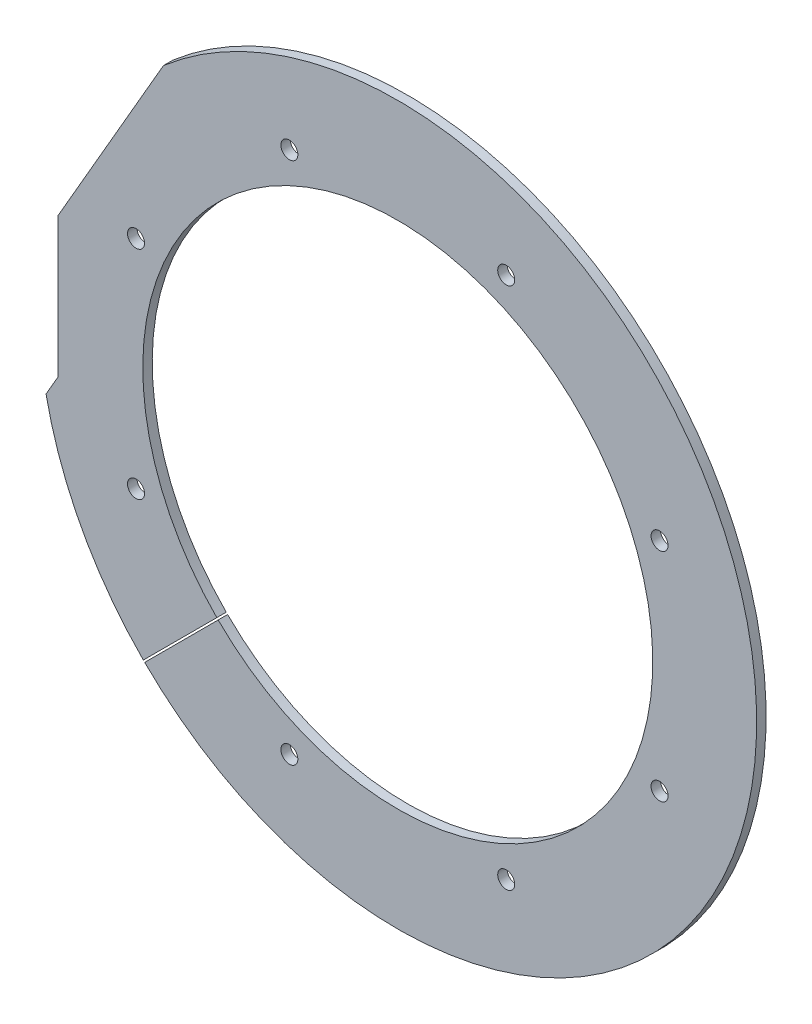
ISO-10303-21;
HEADER;
FILE_DESCRIPTION(('STEP AP214'),'2;1');
FILE_NAME('part.step','',(''),(''),'','','');
FILE_SCHEMA(('AUTOMOTIVE_DESIGN { 1 0 10303 214 1 1 1 1 }'));
ENDSEC;
DATA;
#1=APPLICATION_CONTEXT('core data for automotive mechanical design processes');
#2=APPLICATION_PROTOCOL_DEFINITION('international standard','automotive_design',2000,#1);
#3=PRODUCT_CONTEXT('',#1,'mechanical');
#4=PRODUCT('Part','Part','',(#3));
#5=PRODUCT_RELATED_PRODUCT_CATEGORY('part','',(#4));
#6=PRODUCT_DEFINITION_FORMATION('','',#4);
#7=PRODUCT_DEFINITION_CONTEXT('part definition',#1,'design');
#8=PRODUCT_DEFINITION('design','',#6,#7);
#9=PRODUCT_DEFINITION_SHAPE('','',#8);
#10=(LENGTH_UNIT() NAMED_UNIT(*) SI_UNIT(.MILLI.,.METRE.));
#11=(NAMED_UNIT(*) PLANE_ANGLE_UNIT() SI_UNIT($,.RADIAN.));
#12=(NAMED_UNIT(*) SI_UNIT($,.STERADIAN.) SOLID_ANGLE_UNIT());
#13=UNCERTAINTY_MEASURE_WITH_UNIT(LENGTH_MEASURE(1.E-05),#10,'distance_accuracy_value','');
#14=(GEOMETRIC_REPRESENTATION_CONTEXT(3) GLOBAL_UNCERTAINTY_ASSIGNED_CONTEXT((#13)) GLOBAL_UNIT_ASSIGNED_CONTEXT((#10,
#11,#12)) REPRESENTATION_CONTEXT('',''));
#15=CARTESIAN_POINT('',(0.,0.,0.));
#16=DIRECTION('',(0.,0.,1.));
#17=DIRECTION('',(1.,0.,0.));
#18=AXIS2_PLACEMENT_3D('',#15,#16,#17);
#19=CARTESIAN_POINT('',(6.21070166639274,-0.88442588994114,-166.));
#20=DIRECTION('',(0.,0.,1.));
#21=DIRECTION('',(0.,-1.,0.));
#22=AXIS2_PLACEMENT_3D('',#19,#20,#21);
#23=PLANE('',#22);
#24=CARTESIAN_POINT('',(-57.40251485476,138.5819298767,-166.));
#25=DIRECTION('',(0.,0.,1.));
#26=DIRECTION('',(1.,1.97189285135712E-13,0.));
#27=AXIS2_PLACEMENT_3D('',#24,#25,#26);
#28=CIRCLE('',#27,4.5);
#29=CARTESIAN_POINT('',(-52.90251485476,138.581929876701,-166.));
#30=VERTEX_POINT('',#29);
#31=EDGE_CURVE('E123',#30,#30,#28,.T.);
#32=ORIENTED_EDGE('',*,*,#31,.F.);
#33=EDGE_LOOP('',(#32));
#34=FACE_BOUND('',#33,.T.);
#35=CARTESIAN_POINT('',(-57.40251485476,-138.5819298767,-166.));
#36=DIRECTION('',(0.,0.,1.));
#37=DIRECTION('',(1.,1.97189285135711E-13,0.));
#38=AXIS2_PLACEMENT_3D('',#35,#36,#37);
#39=CIRCLE('',#38,4.5);
#40=CARTESIAN_POINT('',(-52.90251485476,-138.581929876699,-166.));
#41=VERTEX_POINT('',#40);
#42=EDGE_CURVE('E127',#41,#41,#39,.T.);
#43=ORIENTED_EDGE('',*,*,#42,.F.);
#44=EDGE_LOOP('',(#43));
#45=FACE_BOUND('',#44,.T.);
#46=CARTESIAN_POINT('',(57.40251485476,138.5819298767,-166.));
#47=DIRECTION('',(0.,0.,1.));
#48=DIRECTION('',(1.,2.15693002212797E-13,0.));
#49=AXIS2_PLACEMENT_3D('',#46,#47,#48);
#50=CIRCLE('',#49,4.5);
#51=CARTESIAN_POINT('',(61.90251485476,138.581929876701,-166.));
#52=VERTEX_POINT('',#51);
#53=EDGE_CURVE('E131',#52,#52,#50,.T.);
#54=ORIENTED_EDGE('',*,*,#53,.F.);
#55=EDGE_LOOP('',(#54));
#56=FACE_BOUND('',#55,.T.);
#57=CARTESIAN_POINT('',(57.40251485476,-138.5819298767,-166.));
#58=DIRECTION('',(0.,0.,1.));
#59=DIRECTION('',(1.,2.15693002212797E-13,0.));
#60=AXIS2_PLACEMENT_3D('',#57,#58,#59);
#61=CIRCLE('',#60,4.5);
#62=CARTESIAN_POINT('',(61.90251485476,-138.581929876699,-166.));
#63=VERTEX_POINT('',#62);
#64=EDGE_CURVE('E135',#63,#63,#61,.T.);
#65=ORIENTED_EDGE('',*,*,#64,.F.);
#66=EDGE_LOOP('',(#65));
#67=FACE_BOUND('',#66,.T.);
#68=CARTESIAN_POINT('',(-138.5819298767,-57.40251485476,-166.));
#69=DIRECTION('',(0.,0.,1.));
#70=DIRECTION('',(1.,2.06441143674253E-13,0.));
#71=AXIS2_PLACEMENT_3D('',#68,#69,#70);
#72=CIRCLE('',#71,4.5);
#73=CARTESIAN_POINT('',(-134.0819298767,-57.4025148547591,-166.));
#74=VERTEX_POINT('',#73);
#75=EDGE_CURVE('E139',#74,#74,#72,.T.);
#76=ORIENTED_EDGE('',*,*,#75,.F.);
#77=EDGE_LOOP('',(#76));
#78=FACE_BOUND('',#77,.T.);
#79=CARTESIAN_POINT('',(-138.5819298767,57.40251485476,-166.));
#80=DIRECTION('',(0.,0.,1.));
#81=DIRECTION('',(1.,2.06441143674256E-13,0.));
#82=AXIS2_PLACEMENT_3D('',#79,#80,#81);
#83=CIRCLE('',#82,4.5);
#84=CARTESIAN_POINT('',(-134.0819298767,57.4025148547609,-166.));
#85=VERTEX_POINT('',#84);
#86=EDGE_CURVE('E143',#85,#85,#83,.T.);
#87=ORIENTED_EDGE('',*,*,#86,.F.);
#88=EDGE_LOOP('',(#87));
#89=FACE_BOUND('',#88,.T.);
#90=CARTESIAN_POINT('',(138.5819298767,57.40251485476,-166.));
#91=DIRECTION('',(0.,0.,1.));
#92=DIRECTION('',(1.,2.07983120097346E-13,0.));
#93=AXIS2_PLACEMENT_3D('',#90,#91,#92);
#94=CIRCLE('',#93,4.5);
#95=CARTESIAN_POINT('',(143.0819298767,57.4025148547609,-166.));
#96=VERTEX_POINT('',#95);
#97=EDGE_CURVE('E147',#96,#96,#94,.T.);
#98=ORIENTED_EDGE('',*,*,#97,.F.);
#99=EDGE_LOOP('',(#98));
#100=FACE_BOUND('',#99,.T.);
#101=CARTESIAN_POINT('',(138.5819298767,-57.40251485476,-166.));
#102=DIRECTION('',(0.,0.,1.));
#103=DIRECTION('',(1.,2.07983120097343E-13,0.));
#104=AXIS2_PLACEMENT_3D('',#101,#102,#103);
#105=CIRCLE('',#104,4.5);
#106=CARTESIAN_POINT('',(143.0819298767,-57.4025148547591,-166.));
#107=VERTEX_POINT('',#106);
#108=EDGE_CURVE('E151',#107,#107,#105,.T.);
#109=ORIENTED_EDGE('',*,*,#108,.F.);
#110=EDGE_LOOP('',(#109));
#111=FACE_BOUND('',#110,.T.);
#112=DIRECTION('',(0.,-1.,0.));
#113=VECTOR('',#112,1.);
#114=CARTESIAN_POINT('',(-180.,1.89516210700703,-166.));
#115=LINE('',#114,#113);
#116=CARTESIAN_POINT('',(-180.,47.,-166.));
#117=VERTEX_POINT('',#116);
#118=CARTESIAN_POINT('',(-180.,-27.,-166.));
#119=VERTEX_POINT('',#118);
#120=EDGE_CURVE('E159',#117,#119,#115,.T.);
#121=ORIENTED_EDGE('',*,*,#120,.T.);
#122=DIRECTION('',(0.500000000002494,0.866025403782999,0.));
#123=VECTOR('',#122,1.);
#124=CARTESIAN_POINT('',(-122.138949276037,73.2182796325579,-166.));
#125=LINE('',#124,#123);
#126=CARTESIAN_POINT('',(-186.210631307282,-37.7571289712417,-166.));
#127=VERTEX_POINT('',#126);
#128=EDGE_CURVE('E192',#119,#127,#125,.F.);
#129=ORIENTED_EDGE('',*,*,#128,.T.);
#130=CARTESIAN_POINT('',(0.,0.,-166.));
#131=DIRECTION('',(0.,0.,1.));
#132=DIRECTION('',(-0.980055954248756,-0.198721731427544,0.));
#133=AXIS2_PLACEMENT_3D('',#130,#131,#132);
#134=CIRCLE('',#133,190.);
#135=CARTESIAN_POINT('',(-134.703376613408,-133.9962698322,-166.));
#136=VERTEX_POINT('',#135);
#137=EDGE_CURVE('E184',#127,#136,#134,.T.);
#138=ORIENTED_EDGE('',*,*,#137,.T.);
#139=DIRECTION('',(-0.707106781186639,-0.707106781186456,0.));
#140=VECTOR('',#139,1.);
#141=CARTESIAN_POINT('',(2.30958449764395,3.01669127880866,-166.));
#142=LINE('',#141,#140);
#143=CARTESIAN_POINT('',(-95.812314120037,-95.1052073388425,-166.));
#144=VERTEX_POINT('',#143);
#145=EDGE_CURVE('E179',#136,#144,#142,.F.);
#146=ORIENTED_EDGE('',*,*,#145,.T.);
#147=CARTESIAN_POINT('',(0.,0.,-166.));
#148=DIRECTION('',(0.,0.,1.));
#149=DIRECTION('',(-0.704483017324885,-0.709720845333449,0.));
#150=AXIS2_PLACEMENT_3D('',#147,#148,#149);
#151=CIRCLE('',#150,135.);
#152=CARTESIAN_POINT('',(-95.1052073388498,-95.8123141200228,-166.));
#153=VERTEX_POINT('',#152);
#154=EDGE_CURVE('E175',#153,#144,#151,.T.);
#155=ORIENTED_EDGE('',*,*,#154,.F.);
#156=DIRECTION('',(0.707106781186457,0.707106781186639,0.));
#157=VECTOR('',#156,1.);
#158=CARTESIAN_POINT('',(3.01669127880774,2.30958449764304,-166.));
#159=LINE('',#158,#157);
#160=CARTESIAN_POINT('',(-133.996269832188,-134.703376613425,-166.));
#161=VERTEX_POINT('',#160);
#162=EDGE_CURVE('E88',#153,#161,#159,.F.);
#163=ORIENTED_EDGE('',*,*,#162,.T.);
#164=CARTESIAN_POINT('',(0.,0.,-166.));
#165=DIRECTION('',(0.,0.,1.));
#166=DIRECTION('',(-0.705243525432436,-0.708965140070814,0.));
#167=AXIS2_PLACEMENT_3D('',#164,#165,#166);
#168=CIRCLE('',#167,190.);
#169=CARTESIAN_POINT('',(-124.041953570399,143.922179508384,-166.));
#170=VERTEX_POINT('',#169);
#171=EDGE_CURVE('E83',#161,#170,#168,.T.);
#172=ORIENTED_EDGE('',*,*,#171,.T.);
#173=DIRECTION('',(0.499999999999866,0.866025403784516,0.));
#174=VECTOR('',#173,1.);
#175=CARTESIAN_POINT('',(-154.181889216584,91.718279632334,-166.));
#176=LINE('',#175,#174);
#177=EDGE_CURVE('E22',#170,#117,#176,.F.);
#178=ORIENTED_EDGE('',*,*,#177,.T.);
#179=EDGE_LOOP('',(#121,#129,#138,#146,#155,#163,#172,#178));
#180=FACE_BOUND('',#179,.T.);
#181=ADVANCED_FACE('F18',(#34,#45,#56,#67,#78,#89,#100,#111,#180),#23,.T.);
#182=CARTESIAN_POINT('',(-183.10531565365,-32.3785644856249,-168.5));
#183=DIRECTION('',(0.866025403782999,-0.500000000002494,0.));
#184=DIRECTION('',(0.500000000002494,0.866025403782999,0.));
#185=AXIS2_PLACEMENT_3D('',#182,#183,#184);
#186=PLANE('',#185);
#187=ORIENTED_EDGE('',*,*,#128,.F.);
#188=DIRECTION('',(0.,0.,-1.));
#189=VECTOR('',#188,1.);
#190=CARTESIAN_POINT('',(-180.,-27.,-168.5));
#191=LINE('',#190,#189);
#192=CARTESIAN_POINT('',(-180.,-27.,-171.));
#193=VERTEX_POINT('',#192);
#194=EDGE_CURVE('E155',#119,#193,#191,.T.);
#195=ORIENTED_EDGE('',*,*,#194,.T.);
#196=DIRECTION('',(-0.500000000002494,-0.866025403782999,0.));
#197=VECTOR('',#196,1.);
#198=CARTESIAN_POINT('',(-183.10531565365,-32.378564485625,-171.));
#199=LINE('',#198,#197);
#200=CARTESIAN_POINT('',(-186.210631307267,-37.7571289712162,-171.));
#201=VERTEX_POINT('',#200);
#202=EDGE_CURVE('E119',#193,#201,#199,.T.);
#203=ORIENTED_EDGE('',*,*,#202,.T.);
#204=DIRECTION('',(0.,0.,1.));
#205=VECTOR('',#204,1.);
#206=CARTESIAN_POINT('',(-186.210631307263,-37.7571289712334,-171.));
#207=LINE('',#206,#205);
#208=EDGE_CURVE('E188',#201,#127,#207,.T.);
#209=ORIENTED_EDGE('',*,*,#208,.T.);
#210=EDGE_LOOP('',(#187,#195,#203,#209));
#211=FACE_BOUND('',#210,.T.);
#212=ADVANCED_FACE('F340',(#211),#186,.F.);
#213=CARTESIAN_POINT('',(-7.34812490395629E-10,-3.67432266049955E-10,-6000171.));
#214=DIRECTION('',(0.,0.,1.));
#215=DIRECTION('',(0.,-1.,0.));
#216=AXIS2_PLACEMENT_3D('',#213,#214,#215);
#217=CYLINDRICAL_SURFACE('',#216,190.);
#218=DIRECTION('',(0.,0.,1.));
#219=VECTOR('',#218,1.);
#220=CARTESIAN_POINT('',(-134.703376613417,-133.996269832201,-171.));
#221=LINE('',#220,#219);
#222=CARTESIAN_POINT('',(-134.703376613413,-133.996269832205,-171.));
#223=VERTEX_POINT('',#222);
#224=EDGE_CURVE('E180',#223,#136,#221,.T.);
#225=ORIENTED_EDGE('',*,*,#224,.T.);
#226=ORIENTED_EDGE('',*,*,#137,.F.);
#227=ORIENTED_EDGE('',*,*,#208,.F.);
#228=CARTESIAN_POINT('',(0.,0.,-171.));
#229=DIRECTION('',(0.,0.,1.));
#230=DIRECTION('',(-0.980055954248756,-0.198721731427544,0.));
#231=AXIS2_PLACEMENT_3D('',#228,#229,#230);
#232=CIRCLE('',#231,190.);
#233=EDGE_CURVE('E115',#201,#223,#232,.T.);
#234=ORIENTED_EDGE('',*,*,#233,.T.);
#235=EDGE_LOOP('',(#225,#226,#227,#234));
#236=FACE_BOUND('',#235,.T.);
#237=ADVANCED_FACE('F222',(#236),#217,.T.);
#238=CARTESIAN_POINT('',(-115.257845366715,-114.55073858552,-168.5));
#239=DIRECTION('',(-0.707106781186456,0.707106781186639,0.));
#240=DIRECTION('',(-0.707106781186639,-0.707106781186456,0.));
#241=AXIS2_PLACEMENT_3D('',#238,#239,#240);
#242=PLANE('',#241);
#243=ORIENTED_EDGE('',*,*,#145,.F.);
#244=ORIENTED_EDGE('',*,*,#224,.F.);
#245=DIRECTION('',(0.707106781186639,0.707106781186456,0.));
#246=VECTOR('',#245,1.);
#247=CARTESIAN_POINT('',(-115.257845366715,-114.55073858552,-171.));
#248=LINE('',#247,#246);
#249=CARTESIAN_POINT('',(-95.8123141200339,-95.1052073388412,-171.));
#250=VERTEX_POINT('',#249);
#251=EDGE_CURVE('E108',#223,#250,#248,.T.);
#252=ORIENTED_EDGE('',*,*,#251,.T.);
#253=DIRECTION('',(0.,0.,1.));
#254=VECTOR('',#253,1.);
#255=CARTESIAN_POINT('',(-95.8123141200352,-95.1052073388398,-171.));
#256=LINE('',#255,#254);
#257=EDGE_CURVE('E172',#144,#250,#256,.F.);
#258=ORIENTED_EDGE('',*,*,#257,.F.);
#259=EDGE_LOOP('',(#243,#244,#252,#258));
#260=FACE_BOUND('',#259,.T.);
#261=ADVANCED_FACE('F218',(#260),#242,.F.);
#262=CARTESIAN_POINT('',(-7.34802082054774E-10,-3.67418388262146E-10,-6000171.));
#263=DIRECTION('',(0.,0.,1.));
#264=DIRECTION('',(0.,-1.,0.));
#265=AXIS2_PLACEMENT_3D('',#262,#263,#264);
#266=CYLINDRICAL_SURFACE('',#265,135.);
#267=ORIENTED_EDGE('',*,*,#257,.T.);
#268=CARTESIAN_POINT('',(0.,0.,-171.));
#269=DIRECTION('',(0.,0.,1.));
#270=DIRECTION('',(-0.704483017324885,-0.709720845333449,0.));
#271=AXIS2_PLACEMENT_3D('',#268,#269,#270);
#272=CIRCLE('',#271,135.);
#273=CARTESIAN_POINT('',(-95.1052073388425,-95.8123141200325,-171.));
#274=VERTEX_POINT('',#273);
#275=EDGE_CURVE('E104',#250,#274,#272,.F.);
#276=ORIENTED_EDGE('',*,*,#275,.T.);
#277=DIRECTION('',(0.,0.,1.));
#278=VECTOR('',#277,1.);
#279=CARTESIAN_POINT('',(-95.1052073388425,-95.8123141200325,-171.));
#280=LINE('',#279,#278);
#281=EDGE_CURVE('E102',#274,#153,#280,.T.);
#282=ORIENTED_EDGE('',*,*,#281,.T.);
#283=ORIENTED_EDGE('',*,*,#154,.T.);
#284=EDGE_LOOP('',(#267,#276,#282,#283));
#285=FACE_BOUND('',#284,.T.);
#286=ADVANCED_FACE('F212',(#285),#266,.F.);
#287=CARTESIAN_POINT('',(-114.55073858552,-115.257845366715,-168.5));
#288=DIRECTION('',(0.707106781186639,-0.707106781186457,0.));
#289=DIRECTION('',(0.707106781186457,0.707106781186639,0.));
#290=AXIS2_PLACEMENT_3D('',#287,#288,#289);
#291=PLANE('',#290);
#292=ORIENTED_EDGE('',*,*,#162,.F.);
#293=ORIENTED_EDGE('',*,*,#281,.F.);
#294=DIRECTION('',(-0.707106781186457,-0.707106781186639,0.));
#295=VECTOR('',#294,1.);
#296=CARTESIAN_POINT('',(-114.55073858552,-115.257845366715,-171.));
#297=LINE('',#296,#295);
#298=CARTESIAN_POINT('',(-133.996269832186,-134.703376613432,-171.));
#299=VERTEX_POINT('',#298);
#300=EDGE_CURVE('E94',#274,#299,#297,.T.);
#301=ORIENTED_EDGE('',*,*,#300,.T.);
#302=DIRECTION('',(0.,0.,1.));
#303=VECTOR('',#302,1.);
#304=CARTESIAN_POINT('',(-133.996269832163,-134.703376613455,-171.));
#305=LINE('',#304,#303);
#306=EDGE_CURVE('E76',#299,#161,#305,.T.);
#307=ORIENTED_EDGE('',*,*,#306,.T.);
#308=EDGE_LOOP('',(#292,#293,#301,#307));
#309=FACE_BOUND('',#308,.T.);
#310=ADVANCED_FACE('F100',(#309),#291,.F.);
#311=CARTESIAN_POINT('',(-7.3479514316087E-10,-3.67432266049955E-10,-6000171.));
#312=DIRECTION('',(0.,0.,1.));
#313=DIRECTION('',(0.,-1.,0.));
#314=AXIS2_PLACEMENT_3D('',#311,#312,#313);
#315=CYLINDRICAL_SURFACE('',#314,190.);
#316=ORIENTED_EDGE('',*,*,#306,.F.);
#317=CARTESIAN_POINT('',(0.,0.,-171.));
#318=DIRECTION('',(0.,0.,1.));
#319=DIRECTION('',(-0.705243525432436,-0.708965140070814,0.));
#320=AXIS2_PLACEMENT_3D('',#317,#318,#319);
#321=CIRCLE('',#320,190.);
#322=CARTESIAN_POINT('',(-124.041953570418,143.922179508352,-171.));
#323=VERTEX_POINT('',#322);
#324=EDGE_CURVE('E80',#299,#323,#321,.T.);
#325=ORIENTED_EDGE('',*,*,#324,.T.);
#326=DIRECTION('',(0.,0.,1.));
#327=VECTOR('',#326,1.);
#328=CARTESIAN_POINT('',(-124.041953570399,143.922179508369,-171.));
#329=LINE('',#328,#327);
#330=EDGE_CURVE('E165',#323,#170,#329,.T.);
#331=ORIENTED_EDGE('',*,*,#330,.T.);
#332=ORIENTED_EDGE('',*,*,#171,.F.);
#333=EDGE_LOOP('',(#316,#325,#331,#332));
#334=FACE_BOUND('',#333,.T.);
#335=ADVANCED_FACE('F78',(#334),#315,.T.);
#336=CARTESIAN_POINT('',(-152.0209767852,95.4610897542,-168.5));
#337=DIRECTION('',(0.866025403784516,-0.499999999999866,0.));
#338=DIRECTION('',(0.499999999999866,0.866025403784516,0.));
#339=AXIS2_PLACEMENT_3D('',#336,#337,#338);
#340=PLANE('',#339);
#341=ORIENTED_EDGE('',*,*,#177,.F.);
#342=ORIENTED_EDGE('',*,*,#330,.F.);
#343=DIRECTION('',(-0.499999999999866,-0.866025403784516,0.));
#344=VECTOR('',#343,1.);
#345=CARTESIAN_POINT('',(-152.0209767852,95.4610897542,-171.));
#346=LINE('',#345,#344);
#347=CARTESIAN_POINT('',(-180.,47.,-171.));
#348=VERTEX_POINT('',#347);
#349=EDGE_CURVE('E97',#323,#348,#346,.T.);
#350=ORIENTED_EDGE('',*,*,#349,.T.);
#351=DIRECTION('',(0.,0.,1.));
#352=VECTOR('',#351,1.);
#353=CARTESIAN_POINT('',(-180.,47.,-168.5));
#354=LINE('',#353,#352);
#355=EDGE_CURVE('E41',#348,#117,#354,.T.);
#356=ORIENTED_EDGE('',*,*,#355,.T.);
#357=EDGE_LOOP('',(#341,#342,#350,#356));
#358=FACE_BOUND('',#357,.T.);
#359=ADVANCED_FACE('F243',(#358),#340,.F.);
#360=CARTESIAN_POINT('',(-180.,10.,-168.5));
#361=DIRECTION('',(1.,0.,0.));
#362=DIRECTION('',(0.,1.,0.));
#363=AXIS2_PLACEMENT_3D('',#360,#361,#362);
#364=PLANE('',#363);
#365=ORIENTED_EDGE('',*,*,#120,.F.);
#366=ORIENTED_EDGE('',*,*,#355,.F.);
#367=DIRECTION('',(0.,-1.,0.));
#368=VECTOR('',#367,1.);
#369=CARTESIAN_POINT('',(-180.,10.,-171.));
#370=LINE('',#369,#368);
#371=EDGE_CURVE('E245',#348,#193,#370,.T.);
#372=ORIENTED_EDGE('',*,*,#371,.T.);
#373=ORIENTED_EDGE('',*,*,#194,.F.);
#374=EDGE_LOOP('',(#365,#366,#372,#373));
#375=FACE_BOUND('',#374,.T.);
#376=ADVANCED_FACE('F242',(#375),#364,.F.);
#377=CARTESIAN_POINT('',(138.581929875965,-57.4025148551274,-6000171.));
#378=DIRECTION('',(0.,0.,1.));
#379=DIRECTION('',(0.,-1.,0.));
#380=AXIS2_PLACEMENT_3D('',#377,#378,#379);
#381=CYLINDRICAL_SURFACE('',#380,4.5);
#382=ORIENTED_EDGE('',*,*,#108,.T.);
#383=EDGE_LOOP('',(#382));
#384=FACE_BOUND('',#383,.T.);
#385=CARTESIAN_POINT('',(138.5819298767,-57.40251485476,-171.));
#386=DIRECTION('',(0.,0.,1.));
#387=DIRECTION('',(-1.,0.,0.));
#388=AXIS2_PLACEMENT_3D('',#385,#386,#387);
#389=CIRCLE('',#388,4.5);
#390=CARTESIAN_POINT('',(134.0819298767,-57.40251485476,-171.));
#391=VERTEX_POINT('',#390);
#392=EDGE_CURVE('E248',#391,#391,#389,.F.);
#393=ORIENTED_EDGE('',*,*,#392,.T.);
#394=EDGE_LOOP('',(#393));
#395=FACE_BOUND('',#394,.T.);
#396=ADVANCED_FACE('F297',(#384,#395),#381,.F.);
#397=CARTESIAN_POINT('',(138.581929875965,57.4025148543926,-6000171.));
#398=DIRECTION('',(0.,0.,1.));
#399=DIRECTION('',(0.,-1.,0.));
#400=AXIS2_PLACEMENT_3D('',#397,#398,#399);
#401=CYLINDRICAL_SURFACE('',#400,4.5);
#402=ORIENTED_EDGE('',*,*,#97,.T.);
#403=EDGE_LOOP('',(#402));
#404=FACE_BOUND('',#403,.T.);
#405=CARTESIAN_POINT('',(138.5819298767,57.40251485476,-171.));
#406=DIRECTION('',(0.,0.,1.));
#407=DIRECTION('',(-1.,0.,0.));
#408=AXIS2_PLACEMENT_3D('',#405,#406,#407);
#409=CIRCLE('',#408,4.5);
#410=CARTESIAN_POINT('',(134.0819298767,57.40251485476,-171.));
#411=VERTEX_POINT('',#410);
#412=EDGE_CURVE('E254',#411,#411,#409,.F.);
#413=ORIENTED_EDGE('',*,*,#412,.T.);
#414=EDGE_LOOP('',(#413));
#415=FACE_BOUND('',#414,.T.);
#416=ADVANCED_FACE('F299',(#404,#415),#401,.F.);
#417=CARTESIAN_POINT('',(-138.581929877435,57.4025148543926,-6000171.));
#418=DIRECTION('',(0.,0.,1.));
#419=DIRECTION('',(0.,-1.,0.));
#420=AXIS2_PLACEMENT_3D('',#417,#418,#419);
#421=CYLINDRICAL_SURFACE('',#420,4.5);
#422=ORIENTED_EDGE('',*,*,#86,.T.);
#423=EDGE_LOOP('',(#422));
#424=FACE_BOUND('',#423,.T.);
#425=CARTESIAN_POINT('',(-138.5819298767,57.40251485476,-171.));
#426=DIRECTION('',(0.,0.,1.));
#427=DIRECTION('',(-1.,0.,0.));
#428=AXIS2_PLACEMENT_3D('',#425,#426,#427);
#429=CIRCLE('',#428,4.5);
#430=CARTESIAN_POINT('',(-143.0819298767,57.40251485476,-171.));
#431=VERTEX_POINT('',#430);
#432=EDGE_CURVE('E258',#431,#431,#429,.F.);
#433=ORIENTED_EDGE('',*,*,#432,.T.);
#434=EDGE_LOOP('',(#433));
#435=FACE_BOUND('',#434,.T.);
#436=ADVANCED_FACE('F307',(#424,#435),#421,.F.);
#437=CARTESIAN_POINT('',(-138.581929877435,-57.4025148551274,-6000171.));
#438=DIRECTION('',(0.,0.,1.));
#439=DIRECTION('',(0.,-1.,0.));
#440=AXIS2_PLACEMENT_3D('',#437,#438,#439);
#441=CYLINDRICAL_SURFACE('',#440,4.5);
#442=ORIENTED_EDGE('',*,*,#75,.T.);
#443=EDGE_LOOP('',(#442));
#444=FACE_BOUND('',#443,.T.);
#445=CARTESIAN_POINT('',(-138.5819298767,-57.40251485476,-171.));
#446=DIRECTION('',(0.,0.,1.));
#447=DIRECTION('',(-1.,0.,0.));
#448=AXIS2_PLACEMENT_3D('',#445,#446,#447);
#449=CIRCLE('',#448,4.5);
#450=CARTESIAN_POINT('',(-143.0819298767,-57.40251485476,-171.));
#451=VERTEX_POINT('',#450);
#452=EDGE_CURVE('E262',#451,#451,#449,.F.);
#453=ORIENTED_EDGE('',*,*,#452,.T.);
#454=EDGE_LOOP('',(#453));
#455=FACE_BOUND('',#454,.T.);
#456=ADVANCED_FACE('F315',(#444,#455),#441,.F.);
#457=CARTESIAN_POINT('',(57.4025148540252,-138.581929877067,-6000171.));
#458=DIRECTION('',(0.,0.,1.));
#459=DIRECTION('',(0.,-1.,0.));
#460=AXIS2_PLACEMENT_3D('',#457,#458,#459);
#461=CYLINDRICAL_SURFACE('',#460,4.5);
#462=ORIENTED_EDGE('',*,*,#64,.T.);
#463=EDGE_LOOP('',(#462));
#464=FACE_BOUND('',#463,.T.);
#465=CARTESIAN_POINT('',(57.40251485476,-138.5819298767,-171.));
#466=DIRECTION('',(0.,0.,1.));
#467=DIRECTION('',(-1.,0.,0.));
#468=AXIS2_PLACEMENT_3D('',#465,#466,#467);
#469=CIRCLE('',#468,4.5);
#470=CARTESIAN_POINT('',(52.90251485476,-138.5819298767,-171.));
#471=VERTEX_POINT('',#470);
#472=EDGE_CURVE('E266',#471,#471,#469,.F.);
#473=ORIENTED_EDGE('',*,*,#472,.T.);
#474=EDGE_LOOP('',(#473));
#475=FACE_BOUND('',#474,.T.);
#476=ADVANCED_FACE('F319',(#464,#475),#461,.F.);
#477=CARTESIAN_POINT('',(57.4025148540252,138.581929876333,-6000171.));
#478=DIRECTION('',(0.,0.,1.));
#479=DIRECTION('',(0.,-1.,0.));
#480=AXIS2_PLACEMENT_3D('',#477,#478,#479);
#481=CYLINDRICAL_SURFACE('',#480,4.5);
#482=ORIENTED_EDGE('',*,*,#53,.T.);
#483=EDGE_LOOP('',(#482));
#484=FACE_BOUND('',#483,.T.);
#485=CARTESIAN_POINT('',(57.40251485476,138.5819298767,-171.));
#486=DIRECTION('',(0.,0.,1.));
#487=DIRECTION('',(-1.,0.,0.));
#488=AXIS2_PLACEMENT_3D('',#485,#486,#487);
#489=CIRCLE('',#488,4.5);
#490=CARTESIAN_POINT('',(52.90251485476,138.5819298767,-171.));
#491=VERTEX_POINT('',#490);
#492=EDGE_CURVE('E270',#491,#491,#489,.F.);
#493=ORIENTED_EDGE('',*,*,#492,.T.);
#494=EDGE_LOOP('',(#493));
#495=FACE_BOUND('',#494,.T.);
#496=ADVANCED_FACE('F323',(#484,#495),#481,.F.);
#497=CARTESIAN_POINT('',(-57.4025148554948,-138.581929877067,-6000171.));
#498=DIRECTION('',(0.,0.,1.));
#499=DIRECTION('',(0.,-1.,0.));
#500=AXIS2_PLACEMENT_3D('',#497,#498,#499);
#501=CYLINDRICAL_SURFACE('',#500,4.5);
#502=ORIENTED_EDGE('',*,*,#42,.T.);
#503=EDGE_LOOP('',(#502));
#504=FACE_BOUND('',#503,.T.);
#505=CARTESIAN_POINT('',(-57.40251485476,-138.5819298767,-171.));
#506=DIRECTION('',(0.,0.,1.));
#507=DIRECTION('',(-1.,0.,0.));
#508=AXIS2_PLACEMENT_3D('',#505,#506,#507);
#509=CIRCLE('',#508,4.5);
#510=CARTESIAN_POINT('',(-61.90251485476,-138.5819298767,-171.));
#511=VERTEX_POINT('',#510);
#512=EDGE_CURVE('E29',#511,#511,#509,.F.);
#513=ORIENTED_EDGE('',*,*,#512,.T.);
#514=EDGE_LOOP('',(#513));
#515=FACE_BOUND('',#514,.T.);
#516=ADVANCED_FACE('F279',(#504,#515),#501,.F.);
#517=CARTESIAN_POINT('',(-57.4025148554948,138.581929876333,-6000171.));
#518=DIRECTION('',(0.,0.,1.));
#519=DIRECTION('',(0.,-1.,0.));
#520=AXIS2_PLACEMENT_3D('',#517,#518,#519);
#521=CYLINDRICAL_SURFACE('',#520,4.5);
#522=ORIENTED_EDGE('',*,*,#31,.T.);
#523=EDGE_LOOP('',(#522));
#524=FACE_BOUND('',#523,.T.);
#525=CARTESIAN_POINT('',(-57.40251485476,138.5819298767,-171.));
#526=DIRECTION('',(0.,0.,1.));
#527=DIRECTION('',(-1.,0.,0.));
#528=AXIS2_PLACEMENT_3D('',#525,#526,#527);
#529=CIRCLE('',#528,4.5);
#530=CARTESIAN_POINT('',(-61.90251485476,138.5819298767,-171.));
#531=VERTEX_POINT('',#530);
#532=EDGE_CURVE('E11',#531,#531,#529,.F.);
#533=ORIENTED_EDGE('',*,*,#532,.T.);
#534=EDGE_LOOP('',(#533));
#535=FACE_BOUND('',#534,.T.);
#536=ADVANCED_FACE('F283',(#524,#535),#521,.F.);
#537=CARTESIAN_POINT('',(6.21070166639298,-0.884425889941224,-171.));
#538=DIRECTION('',(0.,0.,1.));
#539=DIRECTION('',(0.,-1.,0.));
#540=AXIS2_PLACEMENT_3D('',#537,#538,#539);
#541=PLANE('',#540);
#542=ORIENTED_EDGE('',*,*,#532,.F.);
#543=EDGE_LOOP('',(#542));
#544=FACE_BOUND('',#543,.T.);
#545=ORIENTED_EDGE('',*,*,#512,.F.);
#546=EDGE_LOOP('',(#545));
#547=FACE_BOUND('',#546,.T.);
#548=ORIENTED_EDGE('',*,*,#492,.F.);
#549=EDGE_LOOP('',(#548));
#550=FACE_BOUND('',#549,.T.);
#551=ORIENTED_EDGE('',*,*,#472,.F.);
#552=EDGE_LOOP('',(#551));
#553=FACE_BOUND('',#552,.T.);
#554=ORIENTED_EDGE('',*,*,#452,.F.);
#555=EDGE_LOOP('',(#554));
#556=FACE_BOUND('',#555,.T.);
#557=ORIENTED_EDGE('',*,*,#432,.F.);
#558=EDGE_LOOP('',(#557));
#559=FACE_BOUND('',#558,.T.);
#560=ORIENTED_EDGE('',*,*,#412,.F.);
#561=EDGE_LOOP('',(#560));
#562=FACE_BOUND('',#561,.T.);
#563=ORIENTED_EDGE('',*,*,#392,.F.);
#564=EDGE_LOOP('',(#563));
#565=FACE_BOUND('',#564,.T.);
#566=ORIENTED_EDGE('',*,*,#349,.F.);
#567=ORIENTED_EDGE('',*,*,#324,.F.);
#568=ORIENTED_EDGE('',*,*,#300,.F.);
#569=ORIENTED_EDGE('',*,*,#275,.F.);
#570=ORIENTED_EDGE('',*,*,#251,.F.);
#571=ORIENTED_EDGE('',*,*,#233,.F.);
#572=ORIENTED_EDGE('',*,*,#202,.F.);
#573=ORIENTED_EDGE('',*,*,#371,.F.);
#574=EDGE_LOOP('',(#566,#567,#568,#569,#570,#571,#572,#573));
#575=FACE_BOUND('',#574,.T.);
#576=ADVANCED_FACE('F20',(#544,#547,#550,#553,#556,#559,#562,#565,#575),#541,.F.);
#577=CLOSED_SHELL('',(#181,#212,#237,#261,#286,#310,#335,#359,#376,#396,#416,#436,#456,#476,
#496,#516,#536,#576));
#578=MANIFOLD_SOLID_BREP('B1',#577);
#579=ADVANCED_BREP_SHAPE_REPRESENTATION('',(#18,#578),#14);
#580=SHAPE_DEFINITION_REPRESENTATION(#9,#579);
ENDSEC;
END-ISO-10303-21;
